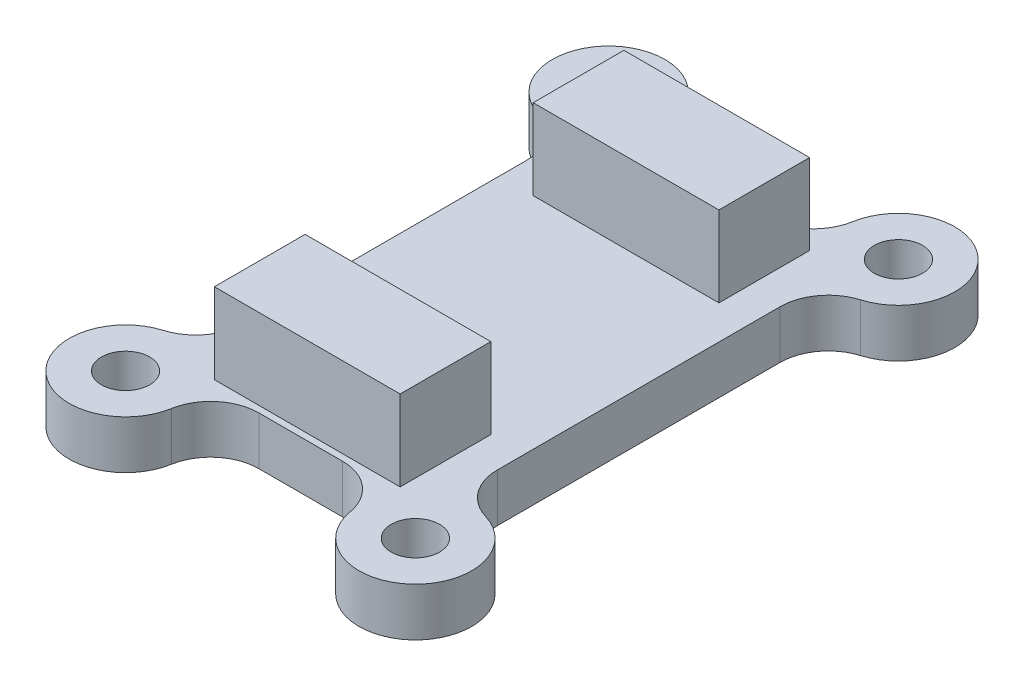
ISO-10303-21;
HEADER;
FILE_DESCRIPTION(('STEP AP214'),'2;1');
FILE_NAME('part.step','',(''),(''),'','','');
FILE_SCHEMA(('AUTOMOTIVE_DESIGN { 1 0 10303 214 1 1 1 1 }'));
ENDSEC;
DATA;
#1=APPLICATION_CONTEXT('core data for automotive mechanical design processes');
#2=APPLICATION_PROTOCOL_DEFINITION('international standard','automotive_design',2000,#1);
#3=PRODUCT_CONTEXT('',#1,'mechanical');
#4=PRODUCT('Part','Part','',(#3));
#5=PRODUCT_RELATED_PRODUCT_CATEGORY('part','',(#4));
#6=PRODUCT_DEFINITION_FORMATION('','',#4);
#7=PRODUCT_DEFINITION_CONTEXT('part definition',#1,'design');
#8=PRODUCT_DEFINITION('design','',#6,#7);
#9=PRODUCT_DEFINITION_SHAPE('','',#8);
#10=(LENGTH_UNIT() NAMED_UNIT(*) SI_UNIT(.MILLI.,.METRE.));
#11=(NAMED_UNIT(*) PLANE_ANGLE_UNIT() SI_UNIT($,.RADIAN.));
#12=(NAMED_UNIT(*) SI_UNIT($,.STERADIAN.) SOLID_ANGLE_UNIT());
#13=UNCERTAINTY_MEASURE_WITH_UNIT(LENGTH_MEASURE(1.E-05),#10,'distance_accuracy_value','');
#14=(GEOMETRIC_REPRESENTATION_CONTEXT(3) GLOBAL_UNCERTAINTY_ASSIGNED_CONTEXT((#13)) GLOBAL_UNIT_ASSIGNED_CONTEXT((#10,
#11,#12)) REPRESENTATION_CONTEXT('',''));
#15=CARTESIAN_POINT('',(0.,0.,0.));
#16=DIRECTION('',(0.,0.,1.));
#17=DIRECTION('',(1.,0.,0.));
#18=AXIS2_PLACEMENT_3D('',#15,#16,#17);
#19=CARTESIAN_POINT('',(0.,3.,0.));
#20=DIRECTION('',(0.,1.,0.));
#21=DIRECTION('',(0.,0.,1.));
#22=AXIS2_PLACEMENT_3D('',#19,#20,#21);
#23=PLANE('',#22);
#24=DIRECTION('',(1.,0.,0.));
#25=VECTOR('',#24,1.);
#26=CARTESIAN_POINT('',(0.,3.,-13.1199094419602));
#27=LINE('',#26,#25);
#28=CARTESIAN_POINT('',(-2.59720351394734,3.,-13.1199094419602));
#29=VERTEX_POINT('',#28);
#30=CARTESIAN_POINT('',(2.59720351394733,3.,-13.1199094419602));
#31=VERTEX_POINT('',#30);
#32=EDGE_CURVE('E315',#29,#31,#27,.T.);
#33=ORIENTED_EDGE('',*,*,#32,.F.);
#34=CARTESIAN_POINT('',(-2.59720351394734,3.,-16.1199094419602));
#35=DIRECTION('',(0.,1.,0.));
#36=DIRECTION('',(0.,0.,1.));
#37=AXIS2_PLACEMENT_3D('',#34,#35,#36);
#38=CIRCLE('',#37,3.);
#39=CARTESIAN_POINT('',(-5.55234035366395,3.,-15.6030281610555));
#40=VERTEX_POINT('',#39);
#41=EDGE_CURVE('E458',#29,#40,#38,.F.);
#42=ORIENTED_EDGE('',*,*,#41,.T.);
#43=CARTESIAN_POINT('',(-9.00000000000001,3.,-15.));
#44=DIRECTION('',(0.,1.,0.));
#45=DIRECTION('',(0.,0.,1.));
#46=AXIS2_PLACEMENT_3D('',#43,#44,#45);
#47=CIRCLE('',#46,3.5);
#48=CARTESIAN_POINT('',(-10.0079707427871,3.,-11.6482847701982));
#49=VERTEX_POINT('',#48);
#50=EDGE_CURVE('E286',#40,#49,#47,.T.);
#51=ORIENTED_EDGE('',*,*,#50,.T.);
#52=CARTESIAN_POINT('',(-10.8719456651761,3.,-8.77538600179671));
#53=DIRECTION('',(0.,1.,0.));
#54=DIRECTION('',(0.,0.,1.));
#55=AXIS2_PLACEMENT_3D('',#52,#53,#54);
#56=CIRCLE('',#55,3.);
#57=CARTESIAN_POINT('',(-7.87194566517612,3.,-8.77538600179671));
#58=VERTEX_POINT('',#57);
#59=EDGE_CURVE('E440',#49,#58,#56,.F.);
#60=ORIENTED_EDGE('',*,*,#59,.T.);
#61=DIRECTION('',(0.,0.,1.));
#62=VECTOR('',#61,1.);
#63=CARTESIAN_POINT('',(-7.87194566517612,3.,0.));
#64=LINE('',#63,#62);
#65=CARTESIAN_POINT('',(-7.87194566517612,3.,8.7753860017967));
#66=VERTEX_POINT('',#65);
#67=EDGE_CURVE('E290',#58,#66,#64,.T.);
#68=ORIENTED_EDGE('',*,*,#67,.T.);
#69=CARTESIAN_POINT('',(-10.8719456651761,3.,8.7753860017967));
#70=DIRECTION('',(0.,1.,0.));
#71=DIRECTION('',(0.,0.,1.));
#72=AXIS2_PLACEMENT_3D('',#69,#70,#71);
#73=CIRCLE('',#72,3.);
#74=CARTESIAN_POINT('',(-10.0079707427871,3.,11.6482847701982));
#75=VERTEX_POINT('',#74);
#76=EDGE_CURVE('E464',#66,#75,#73,.F.);
#77=ORIENTED_EDGE('',*,*,#76,.T.);
#78=CARTESIAN_POINT('',(-9.,3.,15.));
#79=DIRECTION('',(0.,1.,0.));
#80=DIRECTION('',(0.,0.,1.));
#81=AXIS2_PLACEMENT_3D('',#78,#79,#80);
#82=CIRCLE('',#81,3.5);
#83=CARTESIAN_POINT('',(-5.55234035366395,3.,15.6030281610555));
#84=VERTEX_POINT('',#83);
#85=EDGE_CURVE('E295',#75,#84,#82,.T.);
#86=ORIENTED_EDGE('',*,*,#85,.T.);
#87=CARTESIAN_POINT('',(-2.59720351394733,3.,16.1199094419602));
#88=DIRECTION('',(0.,1.,0.));
#89=DIRECTION('',(0.,0.,1.));
#90=AXIS2_PLACEMENT_3D('',#87,#88,#89);
#91=CIRCLE('',#90,3.);
#92=CARTESIAN_POINT('',(-2.59720351394733,3.,13.1199094419602));
#93=VERTEX_POINT('',#92);
#94=EDGE_CURVE('E470',#84,#93,#91,.F.);
#95=ORIENTED_EDGE('',*,*,#94,.T.);
#96=DIRECTION('',(1.,0.,0.));
#97=VECTOR('',#96,1.);
#98=CARTESIAN_POINT('',(0.,3.,13.1199094419602));
#99=LINE('',#98,#97);
#100=CARTESIAN_POINT('',(2.59720351394733,3.,13.1199094419602));
#101=VERTEX_POINT('',#100);
#102=EDGE_CURVE('E299',#93,#101,#99,.T.);
#103=ORIENTED_EDGE('',*,*,#102,.T.);
#104=CARTESIAN_POINT('',(2.59720351394733,3.,16.1199094419602));
#105=DIRECTION('',(0.,1.,0.));
#106=DIRECTION('',(0.,0.,1.));
#107=AXIS2_PLACEMENT_3D('',#104,#105,#106);
#108=CIRCLE('',#107,3.);
#109=CARTESIAN_POINT('',(5.55234035366395,3.,15.6030281610555));
#110=VERTEX_POINT('',#109);
#111=EDGE_CURVE('E476',#101,#110,#108,.F.);
#112=ORIENTED_EDGE('',*,*,#111,.T.);
#113=CARTESIAN_POINT('',(9.,3.,15.));
#114=DIRECTION('',(0.,1.,0.));
#115=DIRECTION('',(0.,0.,1.));
#116=AXIS2_PLACEMENT_3D('',#113,#114,#115);
#117=CIRCLE('',#116,3.5);
#118=CARTESIAN_POINT('',(10.0079707427871,3.,11.6482847701982));
#119=VERTEX_POINT('',#118);
#120=EDGE_CURVE('E303',#110,#119,#117,.T.);
#121=ORIENTED_EDGE('',*,*,#120,.T.);
#122=CARTESIAN_POINT('',(10.8719456651761,3.,8.7753860017967));
#123=DIRECTION('',(0.,1.,0.));
#124=DIRECTION('',(0.,0.,1.));
#125=AXIS2_PLACEMENT_3D('',#122,#123,#124);
#126=CIRCLE('',#125,3.);
#127=CARTESIAN_POINT('',(7.87194566517612,3.,8.7753860017967));
#128=VERTEX_POINT('',#127);
#129=EDGE_CURVE('E11',#119,#128,#126,.F.);
#130=ORIENTED_EDGE('',*,*,#129,.T.);
#131=DIRECTION('',(0.,0.,1.));
#132=VECTOR('',#131,1.);
#133=CARTESIAN_POINT('',(7.87194566517612,3.,0.));
#134=LINE('',#133,#132);
#135=CARTESIAN_POINT('',(7.87194566517612,3.,-8.77538600179672));
#136=VERTEX_POINT('',#135);
#137=EDGE_CURVE('E307',#136,#128,#134,.T.);
#138=ORIENTED_EDGE('',*,*,#137,.F.);
#139=CARTESIAN_POINT('',(10.8719456651761,3.,-8.77538600179672));
#140=DIRECTION('',(0.,1.,0.));
#141=DIRECTION('',(0.,0.,1.));
#142=AXIS2_PLACEMENT_3D('',#139,#140,#141);
#143=CIRCLE('',#142,3.);
#144=CARTESIAN_POINT('',(10.0079707427871,3.,-11.6482847701982));
#145=VERTEX_POINT('',#144);
#146=EDGE_CURVE('E446',#136,#145,#143,.F.);
#147=ORIENTED_EDGE('',*,*,#146,.T.);
#148=CARTESIAN_POINT('',(8.99999999999999,3.,-15.));
#149=DIRECTION('',(0.,1.,0.));
#150=DIRECTION('',(0.,0.,1.));
#151=AXIS2_PLACEMENT_3D('',#148,#149,#150);
#152=CIRCLE('',#151,3.5);
#153=CARTESIAN_POINT('',(5.55234035366394,3.,-15.6030281610555));
#154=VERTEX_POINT('',#153);
#155=EDGE_CURVE('E311',#145,#154,#152,.T.);
#156=ORIENTED_EDGE('',*,*,#155,.T.);
#157=CARTESIAN_POINT('',(2.59720351394733,3.,-16.1199094419602));
#158=DIRECTION('',(0.,1.,0.));
#159=DIRECTION('',(0.,0.,1.));
#160=AXIS2_PLACEMENT_3D('',#157,#158,#159);
#161=CIRCLE('',#160,3.);
#162=EDGE_CURVE('E452',#154,#31,#161,.F.);
#163=ORIENTED_EDGE('',*,*,#162,.T.);
#164=EDGE_LOOP('',(#33,#42,#51,#60,#68,#77,#86,#95,#103,#112,#121,#130,#138,#147,#156,#163));
#165=FACE_BOUND('',#164,.T.);
#166=CARTESIAN_POINT('',(8.99999999999999,3.,-15.));
#167=DIRECTION('',(0.,1.,0.));
#168=DIRECTION('',(0.,0.,1.));
#169=AXIS2_PLACEMENT_3D('',#166,#167,#168);
#170=CIRCLE('',#169,1.5);
#171=CARTESIAN_POINT('',(8.99999999999999,3.,-13.5));
#172=VERTEX_POINT('',#171);
#173=EDGE_CURVE('E319',#172,#172,#170,.T.);
#174=ORIENTED_EDGE('',*,*,#173,.F.);
#175=EDGE_LOOP('',(#174));
#176=FACE_BOUND('',#175,.T.);
#177=CARTESIAN_POINT('',(9.,3.,15.));
#178=DIRECTION('',(0.,1.,0.));
#179=DIRECTION('',(0.,0.,1.));
#180=AXIS2_PLACEMENT_3D('',#177,#178,#179);
#181=CIRCLE('',#180,1.5);
#182=CARTESIAN_POINT('',(9.,3.,16.5));
#183=VERTEX_POINT('',#182);
#184=EDGE_CURVE('E323',#183,#183,#181,.T.);
#185=ORIENTED_EDGE('',*,*,#184,.F.);
#186=EDGE_LOOP('',(#185));
#187=FACE_BOUND('',#186,.T.);
#188=CARTESIAN_POINT('',(-9.,3.,15.));
#189=DIRECTION('',(0.,1.,0.));
#190=DIRECTION('',(0.,0.,1.));
#191=AXIS2_PLACEMENT_3D('',#188,#189,#190);
#192=CIRCLE('',#191,1.5);
#193=CARTESIAN_POINT('',(-9.,3.,16.5));
#194=VERTEX_POINT('',#193);
#195=EDGE_CURVE('E327',#194,#194,#192,.T.);
#196=ORIENTED_EDGE('',*,*,#195,.F.);
#197=EDGE_LOOP('',(#196));
#198=FACE_BOUND('',#197,.T.);
#199=CARTESIAN_POINT('',(-9.00000000000001,3.,-15.));
#200=DIRECTION('',(0.,1.,0.));
#201=DIRECTION('',(0.,0.,1.));
#202=AXIS2_PLACEMENT_3D('',#199,#200,#201);
#203=CIRCLE('',#202,1.5);
#204=CARTESIAN_POINT('',(-9.00000000000001,3.,-13.5));
#205=VERTEX_POINT('',#204);
#206=EDGE_CURVE('E331',#205,#205,#203,.T.);
#207=ORIENTED_EDGE('',*,*,#206,.F.);
#208=EDGE_LOOP('',(#207));
#209=FACE_BOUND('',#208,.T.);
#210=DIRECTION('',(1.,0.,0.));
#211=VECTOR('',#210,1.);
#212=CARTESIAN_POINT('',(-5.76744651204602,3.,-7.08188781014022));
#213=LINE('',#212,#211);
#214=CARTESIAN_POINT('',(-5.76744651204602,3.,-7.08188781014022));
#215=VERTEX_POINT('',#214);
#216=CARTESIAN_POINT('',(5.76744651204602,3.,-7.08188781014022));
#217=VERTEX_POINT('',#216);
#218=EDGE_CURVE('E236',#215,#217,#213,.T.);
#219=ORIENTED_EDGE('',*,*,#218,.F.);
#220=DIRECTION('',(0.,0.,1.));
#221=VECTOR('',#220,1.);
#222=CARTESIAN_POINT('',(-5.76744651204602,3.,-12.7152076591154));
#223=LINE('',#222,#221);
#224=CARTESIAN_POINT('',(-5.76744651204602,3.,-12.7152076591154));
#225=VERTEX_POINT('',#224);
#226=EDGE_CURVE('E231',#225,#215,#223,.T.);
#227=ORIENTED_EDGE('',*,*,#226,.F.);
#228=DIRECTION('',(-1.,0.,0.));
#229=VECTOR('',#228,1.);
#230=CARTESIAN_POINT('',(-5.76744651204602,3.,-12.7152076591154));
#231=LINE('',#230,#229);
#232=CARTESIAN_POINT('',(5.76744651204602,3.,-12.7152076591154));
#233=VERTEX_POINT('',#232);
#234=EDGE_CURVE('E256',#233,#225,#231,.T.);
#235=ORIENTED_EDGE('',*,*,#234,.F.);
#236=DIRECTION('',(0.,0.,-1.));
#237=VECTOR('',#236,1.);
#238=CARTESIAN_POINT('',(5.76744651204602,3.,-12.7152076591154));
#239=LINE('',#238,#237);
#240=EDGE_CURVE('E268',#217,#233,#239,.T.);
#241=ORIENTED_EDGE('',*,*,#240,.F.);
#242=EDGE_LOOP('',(#219,#227,#235,#241));
#243=FACE_BOUND('',#242,.T.);
#244=DIRECTION('',(1.,0.,0.));
#245=VECTOR('',#244,1.);
#246=CARTESIAN_POINT('',(-5.76744651204602,3.,12.7152076591154));
#247=LINE('',#246,#245);
#248=CARTESIAN_POINT('',(-5.76744651204602,3.,12.7152076591154));
#249=VERTEX_POINT('',#248);
#250=CARTESIAN_POINT('',(5.76744651204602,3.,12.7152076591154));
#251=VERTEX_POINT('',#250);
#252=EDGE_CURVE('E229',#249,#251,#247,.T.);
#253=ORIENTED_EDGE('',*,*,#252,.F.);
#254=DIRECTION('',(0.,0.,1.));
#255=VECTOR('',#254,1.);
#256=CARTESIAN_POINT('',(-5.76744651204602,3.,7.08188781014022));
#257=LINE('',#256,#255);
#258=CARTESIAN_POINT('',(-5.76744651204602,3.,7.08188781014022));
#259=VERTEX_POINT('',#258);
#260=EDGE_CURVE('E223',#259,#249,#257,.T.);
#261=ORIENTED_EDGE('',*,*,#260,.F.);
#262=DIRECTION('',(-1.,0.,0.));
#263=VECTOR('',#262,1.);
#264=CARTESIAN_POINT('',(-5.76744651204602,3.,7.08188781014022));
#265=LINE('',#264,#263);
#266=CARTESIAN_POINT('',(5.76744651204602,3.,7.08188781014022));
#267=VERTEX_POINT('',#266);
#268=EDGE_CURVE('E207',#267,#259,#265,.T.);
#269=ORIENTED_EDGE('',*,*,#268,.F.);
#270=DIRECTION('',(0.,0.,-1.));
#271=VECTOR('',#270,1.);
#272=CARTESIAN_POINT('',(5.76744651204602,3.,7.08188781014022));
#273=LINE('',#272,#271);
#274=EDGE_CURVE('E216',#251,#267,#273,.T.);
#275=ORIENTED_EDGE('',*,*,#274,.F.);
#276=EDGE_LOOP('',(#253,#261,#269,#275));
#277=FACE_BOUND('',#276,.T.);
#278=ADVANCED_FACE('F45',(#165,#176,#187,#198,#209,#243,#277),#23,.T.);
#279=CARTESIAN_POINT('',(-9.00000000000001,3.,-15.));
#280=DIRECTION('',(0.,-1.,0.));
#281=DIRECTION('',(0.,0.,-1.));
#282=AXIS2_PLACEMENT_3D('',#279,#280,#281);
#283=CYLINDRICAL_SURFACE('',#282,3.5);
#284=CARTESIAN_POINT('',(-9.00000000000001,0.,-15.));
#285=DIRECTION('',(0.,1.,0.));
#286=DIRECTION('',(0.,0.,1.));
#287=AXIS2_PLACEMENT_3D('',#284,#285,#286);
#288=CIRCLE('',#287,3.5);
#289=CARTESIAN_POINT('',(-5.55234035366395,0.,-15.6030281610555));
#290=VERTEX_POINT('',#289);
#291=CARTESIAN_POINT('',(-10.0079707427871,0.,-11.6482847701982));
#292=VERTEX_POINT('',#291);
#293=EDGE_CURVE('E285',#290,#292,#288,.T.);
#294=ORIENTED_EDGE('',*,*,#293,.T.);
#295=DIRECTION('',(0.,-1.,0.));
#296=VECTOR('',#295,1.);
#297=CARTESIAN_POINT('',(-10.0079707427871,3.,-11.6482847701982));
#298=LINE('',#297,#296);
#299=EDGE_CURVE('E392',#292,#49,#298,.F.);
#300=ORIENTED_EDGE('',*,*,#299,.T.);
#301=ORIENTED_EDGE('',*,*,#50,.F.);
#302=DIRECTION('',(0.,-1.,0.));
#303=VECTOR('',#302,1.);
#304=CARTESIAN_POINT('',(-5.55234035366395,3.,-15.6030281610555));
#305=LINE('',#304,#303);
#306=EDGE_CURVE('E388',#40,#290,#305,.T.);
#307=ORIENTED_EDGE('',*,*,#306,.T.);
#308=EDGE_LOOP('',(#294,#300,#301,#307));
#309=FACE_BOUND('',#308,.T.);
#310=ADVANCED_FACE('F524',(#309),#283,.T.);
#311=CARTESIAN_POINT('',(-7.87194566517612,3.,0.));
#312=DIRECTION('',(1.,0.,0.));
#313=DIRECTION('',(0.,0.,-1.));
#314=AXIS2_PLACEMENT_3D('',#311,#312,#313);
#315=PLANE('',#314);
#316=ORIENTED_EDGE('',*,*,#67,.F.);
#317=DIRECTION('',(0.,1.,0.));
#318=VECTOR('',#317,1.);
#319=CARTESIAN_POINT('',(-7.87194566517612,0.,-8.77538600179671));
#320=LINE('',#319,#318);
#321=CARTESIAN_POINT('',(-7.87194566517612,0.,-8.77538600179671));
#322=VERTEX_POINT('',#321);
#323=EDGE_CURVE('E384',#58,#322,#320,.F.);
#324=ORIENTED_EDGE('',*,*,#323,.T.);
#325=DIRECTION('',(0.,0.,1.));
#326=VECTOR('',#325,1.);
#327=CARTESIAN_POINT('',(-7.87194566517612,0.,0.));
#328=LINE('',#327,#326);
#329=CARTESIAN_POINT('',(-7.87194566517612,0.,8.7753860017967));
#330=VERTEX_POINT('',#329);
#331=EDGE_CURVE('E339',#322,#330,#328,.T.);
#332=ORIENTED_EDGE('',*,*,#331,.T.);
#333=DIRECTION('',(0.,1.,0.));
#334=VECTOR('',#333,1.);
#335=CARTESIAN_POINT('',(-7.87194566517612,3.,8.7753860017967));
#336=LINE('',#335,#334);
#337=EDGE_CURVE('E335',#330,#66,#336,.T.);
#338=ORIENTED_EDGE('',*,*,#337,.T.);
#339=EDGE_LOOP('',(#316,#324,#332,#338));
#340=FACE_BOUND('',#339,.T.);
#341=ADVANCED_FACE('F532',(#340),#315,.F.);
#342=CARTESIAN_POINT('',(-9.,3.,15.));
#343=DIRECTION('',(0.,-1.,0.));
#344=DIRECTION('',(0.,0.,-1.));
#345=AXIS2_PLACEMENT_3D('',#342,#343,#344);
#346=CYLINDRICAL_SURFACE('',#345,3.5);
#347=ORIENTED_EDGE('',*,*,#85,.F.);
#348=DIRECTION('',(0.,-1.,0.));
#349=VECTOR('',#348,1.);
#350=CARTESIAN_POINT('',(-10.0079707427871,3.,11.6482847701982));
#351=LINE('',#350,#349);
#352=CARTESIAN_POINT('',(-10.0079707427871,0.,11.6482847701982));
#353=VERTEX_POINT('',#352);
#354=EDGE_CURVE('E419',#75,#353,#351,.T.);
#355=ORIENTED_EDGE('',*,*,#354,.T.);
#356=CARTESIAN_POINT('',(-9.,0.,15.));
#357=DIRECTION('',(0.,1.,0.));
#358=DIRECTION('',(0.,0.,1.));
#359=AXIS2_PLACEMENT_3D('',#356,#357,#358);
#360=CIRCLE('',#359,3.5);
#361=CARTESIAN_POINT('',(-5.55234035366395,0.,15.6030281610555));
#362=VERTEX_POINT('',#361);
#363=EDGE_CURVE('E343',#353,#362,#360,.T.);
#364=ORIENTED_EDGE('',*,*,#363,.T.);
#365=DIRECTION('',(0.,-1.,0.));
#366=VECTOR('',#365,1.);
#367=CARTESIAN_POINT('',(-5.55234035366395,3.,15.6030281610555));
#368=LINE('',#367,#366);
#369=EDGE_CURVE('E416',#362,#84,#368,.F.);
#370=ORIENTED_EDGE('',*,*,#369,.T.);
#371=EDGE_LOOP('',(#347,#355,#364,#370));
#372=FACE_BOUND('',#371,.T.);
#373=ADVANCED_FACE('F541',(#372),#346,.T.);
#374=CARTESIAN_POINT('',(0.,3.,13.1199094419602));
#375=DIRECTION('',(0.,0.,-1.));
#376=DIRECTION('',(-1.,0.,0.));
#377=AXIS2_PLACEMENT_3D('',#374,#375,#376);
#378=PLANE('',#377);
#379=ORIENTED_EDGE('',*,*,#102,.F.);
#380=DIRECTION('',(0.,1.,0.));
#381=VECTOR('',#380,1.);
#382=CARTESIAN_POINT('',(-2.59720351394733,0.,13.1199094419602));
#383=LINE('',#382,#381);
#384=CARTESIAN_POINT('',(-2.59720351394733,0.,13.1199094419602));
#385=VERTEX_POINT('',#384);
#386=EDGE_CURVE('E426',#93,#385,#383,.F.);
#387=ORIENTED_EDGE('',*,*,#386,.T.);
#388=DIRECTION('',(1.,0.,0.));
#389=VECTOR('',#388,1.);
#390=CARTESIAN_POINT('',(0.,0.,13.1199094419602));
#391=LINE('',#390,#389);
#392=CARTESIAN_POINT('',(2.59720351394733,0.,13.1199094419602));
#393=VERTEX_POINT('',#392);
#394=EDGE_CURVE('E347',#385,#393,#391,.T.);
#395=ORIENTED_EDGE('',*,*,#394,.T.);
#396=DIRECTION('',(0.,1.,0.));
#397=VECTOR('',#396,1.);
#398=CARTESIAN_POINT('',(2.59720351394733,3.,13.1199094419602));
#399=LINE('',#398,#397);
#400=EDGE_CURVE('E423',#393,#101,#399,.T.);
#401=ORIENTED_EDGE('',*,*,#400,.T.);
#402=EDGE_LOOP('',(#379,#387,#395,#401));
#403=FACE_BOUND('',#402,.T.);
#404=ADVANCED_FACE('F550',(#403),#378,.F.);
#405=CARTESIAN_POINT('',(9.,3.,15.));
#406=DIRECTION('',(0.,-1.,0.));
#407=DIRECTION('',(0.,0.,-1.));
#408=AXIS2_PLACEMENT_3D('',#405,#406,#407);
#409=CYLINDRICAL_SURFACE('',#408,3.5);
#410=ORIENTED_EDGE('',*,*,#120,.F.);
#411=DIRECTION('',(0.,-1.,0.));
#412=VECTOR('',#411,1.);
#413=CARTESIAN_POINT('',(5.55234035366395,3.,15.6030281610555));
#414=LINE('',#413,#412);
#415=CARTESIAN_POINT('',(5.55234035366395,0.,15.6030281610555));
#416=VERTEX_POINT('',#415);
#417=EDGE_CURVE('E433',#110,#416,#414,.T.);
#418=ORIENTED_EDGE('',*,*,#417,.T.);
#419=CARTESIAN_POINT('',(9.,0.,15.));
#420=DIRECTION('',(0.,1.,0.));
#421=DIRECTION('',(0.,0.,1.));
#422=AXIS2_PLACEMENT_3D('',#419,#420,#421);
#423=CIRCLE('',#422,3.5);
#424=CARTESIAN_POINT('',(10.0079707427871,0.,11.6482847701982));
#425=VERTEX_POINT('',#424);
#426=EDGE_CURVE('E351',#416,#425,#423,.T.);
#427=ORIENTED_EDGE('',*,*,#426,.T.);
#428=DIRECTION('',(0.,-1.,0.));
#429=VECTOR('',#428,1.);
#430=CARTESIAN_POINT('',(10.0079707427871,3.,11.6482847701982));
#431=LINE('',#430,#429);
#432=EDGE_CURVE('E430',#425,#119,#431,.F.);
#433=ORIENTED_EDGE('',*,*,#432,.T.);
#434=EDGE_LOOP('',(#410,#418,#427,#433));
#435=FACE_BOUND('',#434,.T.);
#436=ADVANCED_FACE('F490',(#435),#409,.T.);
#437=CARTESIAN_POINT('',(7.87194566517612,3.,0.));
#438=DIRECTION('',(1.,0.,0.));
#439=DIRECTION('',(0.,0.,-1.));
#440=AXIS2_PLACEMENT_3D('',#437,#438,#439);
#441=PLANE('',#440);
#442=DIRECTION('',(0.,0.,1.));
#443=VECTOR('',#442,1.);
#444=CARTESIAN_POINT('',(7.87194566517612,0.,0.));
#445=LINE('',#444,#443);
#446=CARTESIAN_POINT('',(7.87194566517612,0.,-8.77538600179672));
#447=VERTEX_POINT('',#446);
#448=CARTESIAN_POINT('',(7.87194566517612,0.,8.7753860017967));
#449=VERTEX_POINT('',#448);
#450=EDGE_CURVE('E355',#447,#449,#445,.T.);
#451=ORIENTED_EDGE('',*,*,#450,.F.);
#452=DIRECTION('',(0.,-1.,0.));
#453=VECTOR('',#452,1.);
#454=CARTESIAN_POINT('',(7.87194566517612,3.,-8.77538600179672));
#455=LINE('',#454,#453);
#456=EDGE_CURVE('E406',#447,#136,#455,.F.);
#457=ORIENTED_EDGE('',*,*,#456,.T.);
#458=ORIENTED_EDGE('',*,*,#137,.T.);
#459=DIRECTION('',(0.,-1.,0.));
#460=VECTOR('',#459,1.);
#461=CARTESIAN_POINT('',(7.87194566517612,3.,8.7753860017967));
#462=LINE('',#461,#460);
#463=EDGE_CURVE('E402',#128,#449,#462,.T.);
#464=ORIENTED_EDGE('',*,*,#463,.T.);
#465=EDGE_LOOP('',(#451,#457,#458,#464));
#466=FACE_BOUND('',#465,.T.);
#467=ADVANCED_FACE('F499',(#466),#441,.T.);
#468=CARTESIAN_POINT('',(8.99999999999999,3.,-15.));
#469=DIRECTION('',(0.,-1.,0.));
#470=DIRECTION('',(0.,0.,-1.));
#471=AXIS2_PLACEMENT_3D('',#468,#469,#470);
#472=CYLINDRICAL_SURFACE('',#471,3.5);
#473=ORIENTED_EDGE('',*,*,#155,.F.);
#474=DIRECTION('',(0.,-1.,0.));
#475=VECTOR('',#474,1.);
#476=CARTESIAN_POINT('',(10.0079707427871,3.,-11.6482847701982));
#477=LINE('',#476,#475);
#478=CARTESIAN_POINT('',(10.0079707427871,0.,-11.6482847701982));
#479=VERTEX_POINT('',#478);
#480=EDGE_CURVE('E398',#145,#479,#477,.T.);
#481=ORIENTED_EDGE('',*,*,#480,.T.);
#482=CARTESIAN_POINT('',(8.99999999999999,0.,-15.));
#483=DIRECTION('',(0.,1.,0.));
#484=DIRECTION('',(0.,0.,1.));
#485=AXIS2_PLACEMENT_3D('',#482,#483,#484);
#486=CIRCLE('',#485,3.5);
#487=CARTESIAN_POINT('',(5.55234035366394,0.,-15.6030281610555));
#488=VERTEX_POINT('',#487);
#489=EDGE_CURVE('E359',#479,#488,#486,.T.);
#490=ORIENTED_EDGE('',*,*,#489,.T.);
#491=DIRECTION('',(0.,-1.,0.));
#492=VECTOR('',#491,1.);
#493=CARTESIAN_POINT('',(5.55234035366394,3.,-15.6030281610555));
#494=LINE('',#493,#492);
#495=EDGE_CURVE('E395',#488,#154,#494,.F.);
#496=ORIENTED_EDGE('',*,*,#495,.T.);
#497=EDGE_LOOP('',(#473,#481,#490,#496));
#498=FACE_BOUND('',#497,.T.);
#499=ADVANCED_FACE('F507',(#498),#472,.T.);
#500=CARTESIAN_POINT('',(-9.,3.,15.));
#501=DIRECTION('',(0.,-1.,0.));
#502=DIRECTION('',(0.,0.,-1.));
#503=AXIS2_PLACEMENT_3D('',#500,#501,#502);
#504=CYLINDRICAL_SURFACE('',#503,1.5);
#505=ORIENTED_EDGE('',*,*,#195,.T.);
#506=EDGE_LOOP('',(#505));
#507=FACE_BOUND('',#506,.T.);
#508=CARTESIAN_POINT('',(-9.,0.,15.));
#509=DIRECTION('',(0.,1.,0.));
#510=DIRECTION('',(0.,0.,1.));
#511=AXIS2_PLACEMENT_3D('',#508,#509,#510);
#512=CIRCLE('',#511,1.5);
#513=CARTESIAN_POINT('',(-9.,0.,16.5));
#514=VERTEX_POINT('',#513);
#515=EDGE_CURVE('E375',#514,#514,#512,.T.);
#516=ORIENTED_EDGE('',*,*,#515,.F.);
#517=EDGE_LOOP('',(#516));
#518=FACE_BOUND('',#517,.T.);
#519=ADVANCED_FACE('F577',(#507,#518),#504,.F.);
#520=CARTESIAN_POINT('',(9.,3.,15.));
#521=DIRECTION('',(0.,-1.,0.));
#522=DIRECTION('',(0.,0.,-1.));
#523=AXIS2_PLACEMENT_3D('',#520,#521,#522);
#524=CYLINDRICAL_SURFACE('',#523,1.5);
#525=ORIENTED_EDGE('',*,*,#184,.T.);
#526=EDGE_LOOP('',(#525));
#527=FACE_BOUND('',#526,.T.);
#528=CARTESIAN_POINT('',(9.,0.,15.));
#529=DIRECTION('',(0.,1.,0.));
#530=DIRECTION('',(0.,0.,1.));
#531=AXIS2_PLACEMENT_3D('',#528,#529,#530);
#532=CIRCLE('',#531,1.5);
#533=CARTESIAN_POINT('',(9.,0.,16.5));
#534=VERTEX_POINT('',#533);
#535=EDGE_CURVE('E371',#534,#534,#532,.T.);
#536=ORIENTED_EDGE('',*,*,#535,.F.);
#537=EDGE_LOOP('',(#536));
#538=FACE_BOUND('',#537,.T.);
#539=ADVANCED_FACE('F580',(#527,#538),#524,.F.);
#540=CARTESIAN_POINT('',(8.99999999999999,3.,-15.));
#541=DIRECTION('',(0.,-1.,0.));
#542=DIRECTION('',(0.,0.,-1.));
#543=AXIS2_PLACEMENT_3D('',#540,#541,#542);
#544=CYLINDRICAL_SURFACE('',#543,1.5);
#545=ORIENTED_EDGE('',*,*,#173,.T.);
#546=EDGE_LOOP('',(#545));
#547=FACE_BOUND('',#546,.T.);
#548=CARTESIAN_POINT('',(8.99999999999999,0.,-15.));
#549=DIRECTION('',(0.,1.,0.));
#550=DIRECTION('',(0.,0.,1.));
#551=AXIS2_PLACEMENT_3D('',#548,#549,#550);
#552=CIRCLE('',#551,1.5);
#553=CARTESIAN_POINT('',(8.99999999999999,0.,-13.5));
#554=VERTEX_POINT('',#553);
#555=EDGE_CURVE('E367',#554,#554,#552,.T.);
#556=ORIENTED_EDGE('',*,*,#555,.F.);
#557=EDGE_LOOP('',(#556));
#558=FACE_BOUND('',#557,.T.);
#559=ADVANCED_FACE('F584',(#547,#558),#544,.F.);
#560=CARTESIAN_POINT('',(0.,3.,-13.1199094419602));
#561=DIRECTION('',(0.,0.,-1.));
#562=DIRECTION('',(-1.,0.,0.));
#563=AXIS2_PLACEMENT_3D('',#560,#561,#562);
#564=PLANE('',#563);
#565=ORIENTED_EDGE('',*,*,#32,.T.);
#566=DIRECTION('',(0.,-1.,0.));
#567=VECTOR('',#566,1.);
#568=CARTESIAN_POINT('',(2.59720351394733,3.,-13.1199094419602));
#569=LINE('',#568,#567);
#570=CARTESIAN_POINT('',(2.59720351394733,0.,-13.1199094419602));
#571=VERTEX_POINT('',#570);
#572=EDGE_CURVE('E412',#31,#571,#569,.T.);
#573=ORIENTED_EDGE('',*,*,#572,.T.);
#574=DIRECTION('',(1.,0.,0.));
#575=VECTOR('',#574,1.);
#576=CARTESIAN_POINT('',(0.,0.,-13.1199094419602));
#577=LINE('',#576,#575);
#578=CARTESIAN_POINT('',(-2.59720351394734,0.,-13.1199094419602));
#579=VERTEX_POINT('',#578);
#580=EDGE_CURVE('E363',#579,#571,#577,.T.);
#581=ORIENTED_EDGE('',*,*,#580,.F.);
#582=DIRECTION('',(0.,-1.,0.));
#583=VECTOR('',#582,1.);
#584=CARTESIAN_POINT('',(-2.59720351394734,3.,-13.1199094419602));
#585=LINE('',#584,#583);
#586=EDGE_CURVE('E409',#579,#29,#585,.F.);
#587=ORIENTED_EDGE('',*,*,#586,.T.);
#588=EDGE_LOOP('',(#565,#573,#581,#587));
#589=FACE_BOUND('',#588,.T.);
#590=ADVANCED_FACE('F515',(#589),#564,.T.);
#591=CARTESIAN_POINT('',(-9.00000000000001,3.,-15.));
#592=DIRECTION('',(0.,-1.,0.));
#593=DIRECTION('',(0.,0.,-1.));
#594=AXIS2_PLACEMENT_3D('',#591,#592,#593);
#595=CYLINDRICAL_SURFACE('',#594,1.5);
#596=ORIENTED_EDGE('',*,*,#206,.T.);
#597=EDGE_LOOP('',(#596));
#598=FACE_BOUND('',#597,.T.);
#599=CARTESIAN_POINT('',(-9.00000000000001,0.,-15.));
#600=DIRECTION('',(0.,1.,0.));
#601=DIRECTION('',(0.,0.,1.));
#602=AXIS2_PLACEMENT_3D('',#599,#600,#601);
#603=CIRCLE('',#602,1.5);
#604=CARTESIAN_POINT('',(-9.00000000000001,0.,-13.5));
#605=VERTEX_POINT('',#604);
#606=EDGE_CURVE('E291',#605,#605,#603,.T.);
#607=ORIENTED_EDGE('',*,*,#606,.F.);
#608=EDGE_LOOP('',(#607));
#609=FACE_BOUND('',#608,.T.);
#610=ADVANCED_FACE('F573',(#598,#609),#595,.F.);
#611=CARTESIAN_POINT('',(0.,0.,0.));
#612=DIRECTION('',(0.,1.,0.));
#613=DIRECTION('',(0.,0.,1.));
#614=AXIS2_PLACEMENT_3D('',#611,#612,#613);
#615=PLANE('',#614);
#616=ORIENTED_EDGE('',*,*,#293,.F.);
#617=CARTESIAN_POINT('',(-2.59720351394734,0.,-16.1199094419602));
#618=DIRECTION('',(0.,1.,0.));
#619=DIRECTION('',(0.,0.,1.));
#620=AXIS2_PLACEMENT_3D('',#617,#618,#619);
#621=CIRCLE('',#620,3.);
#622=EDGE_CURVE('E455',#290,#579,#621,.T.);
#623=ORIENTED_EDGE('',*,*,#622,.T.);
#624=ORIENTED_EDGE('',*,*,#580,.T.);
#625=CARTESIAN_POINT('',(2.59720351394733,0.,-16.1199094419602));
#626=DIRECTION('',(0.,1.,0.));
#627=DIRECTION('',(0.,0.,1.));
#628=AXIS2_PLACEMENT_3D('',#625,#626,#627);
#629=CIRCLE('',#628,3.);
#630=EDGE_CURVE('E449',#571,#488,#629,.T.);
#631=ORIENTED_EDGE('',*,*,#630,.T.);
#632=ORIENTED_EDGE('',*,*,#489,.F.);
#633=CARTESIAN_POINT('',(10.8719456651761,0.,-8.77538600179672));
#634=DIRECTION('',(0.,1.,0.));
#635=DIRECTION('',(0.,0.,1.));
#636=AXIS2_PLACEMENT_3D('',#633,#634,#635);
#637=CIRCLE('',#636,3.);
#638=EDGE_CURVE('E443',#479,#447,#637,.T.);
#639=ORIENTED_EDGE('',*,*,#638,.T.);
#640=ORIENTED_EDGE('',*,*,#450,.T.);
#641=CARTESIAN_POINT('',(10.8719456651761,0.,8.7753860017967));
#642=DIRECTION('',(0.,1.,0.));
#643=DIRECTION('',(0.,0.,1.));
#644=AXIS2_PLACEMENT_3D('',#641,#642,#643);
#645=CIRCLE('',#644,3.);
#646=EDGE_CURVE('E54',#449,#425,#645,.T.);
#647=ORIENTED_EDGE('',*,*,#646,.T.);
#648=ORIENTED_EDGE('',*,*,#426,.F.);
#649=CARTESIAN_POINT('',(2.59720351394733,0.,16.1199094419602));
#650=DIRECTION('',(0.,1.,0.));
#651=DIRECTION('',(0.,0.,1.));
#652=AXIS2_PLACEMENT_3D('',#649,#650,#651);
#653=CIRCLE('',#652,3.);
#654=EDGE_CURVE('E473',#416,#393,#653,.T.);
#655=ORIENTED_EDGE('',*,*,#654,.T.);
#656=ORIENTED_EDGE('',*,*,#394,.F.);
#657=CARTESIAN_POINT('',(-2.59720351394733,0.,16.1199094419602));
#658=DIRECTION('',(0.,1.,0.));
#659=DIRECTION('',(0.,0.,1.));
#660=AXIS2_PLACEMENT_3D('',#657,#658,#659);
#661=CIRCLE('',#660,3.);
#662=EDGE_CURVE('E467',#385,#362,#661,.T.);
#663=ORIENTED_EDGE('',*,*,#662,.T.);
#664=ORIENTED_EDGE('',*,*,#363,.F.);
#665=CARTESIAN_POINT('',(-10.8719456651761,0.,8.7753860017967));
#666=DIRECTION('',(0.,1.,0.));
#667=DIRECTION('',(0.,0.,1.));
#668=AXIS2_PLACEMENT_3D('',#665,#666,#667);
#669=CIRCLE('',#668,3.);
#670=EDGE_CURVE('E461',#353,#330,#669,.T.);
#671=ORIENTED_EDGE('',*,*,#670,.T.);
#672=ORIENTED_EDGE('',*,*,#331,.F.);
#673=CARTESIAN_POINT('',(-10.8719456651761,0.,-8.77538600179671));
#674=DIRECTION('',(0.,1.,0.));
#675=DIRECTION('',(0.,0.,1.));
#676=AXIS2_PLACEMENT_3D('',#673,#674,#675);
#677=CIRCLE('',#676,3.);
#678=EDGE_CURVE('E437',#322,#292,#677,.T.);
#679=ORIENTED_EDGE('',*,*,#678,.T.);
#680=EDGE_LOOP('',(#616,#623,#624,#631,#632,#639,#640,#647,#648,#655,#656,#663,#664,#671,#672,#679));
#681=FACE_BOUND('',#680,.T.);
#682=ORIENTED_EDGE('',*,*,#555,.T.);
#683=EDGE_LOOP('',(#682));
#684=FACE_BOUND('',#683,.T.);
#685=ORIENTED_EDGE('',*,*,#535,.T.);
#686=EDGE_LOOP('',(#685));
#687=FACE_BOUND('',#686,.T.);
#688=ORIENTED_EDGE('',*,*,#515,.T.);
#689=EDGE_LOOP('',(#688));
#690=FACE_BOUND('',#689,.T.);
#691=ORIENTED_EDGE('',*,*,#606,.T.);
#692=EDGE_LOOP('',(#691));
#693=FACE_BOUND('',#692,.T.);
#694=ADVANCED_FACE('F482',(#681,#684,#687,#690,#693),#615,.F.);
#695=CARTESIAN_POINT('',(-10.8719456651761,3.,-8.77538600179671));
#696=DIRECTION('',(0.,-1.,0.));
#697=DIRECTION('',(0.,0.,-1.));
#698=AXIS2_PLACEMENT_3D('',#695,#696,#697);
#699=CYLINDRICAL_SURFACE('',#698,3.);
#700=ORIENTED_EDGE('',*,*,#59,.F.);
#701=ORIENTED_EDGE('',*,*,#299,.F.);
#702=ORIENTED_EDGE('',*,*,#678,.F.);
#703=ORIENTED_EDGE('',*,*,#323,.F.);
#704=EDGE_LOOP('',(#700,#701,#702,#703));
#705=FACE_BOUND('',#704,.T.);
#706=ADVANCED_FACE('F527',(#705),#699,.F.);
#707=CARTESIAN_POINT('',(10.8719456651761,3.,-8.77538600179672));
#708=DIRECTION('',(0.,-1.,0.));
#709=DIRECTION('',(0.,0.,-1.));
#710=AXIS2_PLACEMENT_3D('',#707,#708,#709);
#711=CYLINDRICAL_SURFACE('',#710,3.);
#712=ORIENTED_EDGE('',*,*,#146,.F.);
#713=ORIENTED_EDGE('',*,*,#456,.F.);
#714=ORIENTED_EDGE('',*,*,#638,.F.);
#715=ORIENTED_EDGE('',*,*,#480,.F.);
#716=EDGE_LOOP('',(#712,#713,#714,#715));
#717=FACE_BOUND('',#716,.T.);
#718=ADVANCED_FACE('F502',(#717),#711,.F.);
#719=CARTESIAN_POINT('',(2.59720351394733,3.,-16.1199094419602));
#720=DIRECTION('',(0.,-1.,0.));
#721=DIRECTION('',(0.,0.,-1.));
#722=AXIS2_PLACEMENT_3D('',#719,#720,#721);
#723=CYLINDRICAL_SURFACE('',#722,3.);
#724=ORIENTED_EDGE('',*,*,#162,.F.);
#725=ORIENTED_EDGE('',*,*,#495,.F.);
#726=ORIENTED_EDGE('',*,*,#630,.F.);
#727=ORIENTED_EDGE('',*,*,#572,.F.);
#728=EDGE_LOOP('',(#724,#725,#726,#727));
#729=FACE_BOUND('',#728,.T.);
#730=ADVANCED_FACE('F511',(#729),#723,.F.);
#731=CARTESIAN_POINT('',(-2.59720351394734,3.,-16.1199094419602));
#732=DIRECTION('',(0.,-1.,0.));
#733=DIRECTION('',(0.,0.,-1.));
#734=AXIS2_PLACEMENT_3D('',#731,#732,#733);
#735=CYLINDRICAL_SURFACE('',#734,3.);
#736=ORIENTED_EDGE('',*,*,#41,.F.);
#737=ORIENTED_EDGE('',*,*,#586,.F.);
#738=ORIENTED_EDGE('',*,*,#622,.F.);
#739=ORIENTED_EDGE('',*,*,#306,.F.);
#740=EDGE_LOOP('',(#736,#737,#738,#739));
#741=FACE_BOUND('',#740,.T.);
#742=ADVANCED_FACE('F519',(#741),#735,.F.);
#743=CARTESIAN_POINT('',(-10.8719456651761,3.,8.7753860017967));
#744=DIRECTION('',(0.,-1.,0.));
#745=DIRECTION('',(0.,0.,-1.));
#746=AXIS2_PLACEMENT_3D('',#743,#744,#745);
#747=CYLINDRICAL_SURFACE('',#746,3.);
#748=ORIENTED_EDGE('',*,*,#76,.F.);
#749=ORIENTED_EDGE('',*,*,#337,.F.);
#750=ORIENTED_EDGE('',*,*,#670,.F.);
#751=ORIENTED_EDGE('',*,*,#354,.F.);
#752=EDGE_LOOP('',(#748,#749,#750,#751));
#753=FACE_BOUND('',#752,.T.);
#754=ADVANCED_FACE('F536',(#753),#747,.F.);
#755=CARTESIAN_POINT('',(-2.59720351394733,3.,16.1199094419602));
#756=DIRECTION('',(0.,-1.,0.));
#757=DIRECTION('',(0.,0.,-1.));
#758=AXIS2_PLACEMENT_3D('',#755,#756,#757);
#759=CYLINDRICAL_SURFACE('',#758,3.);
#760=ORIENTED_EDGE('',*,*,#94,.F.);
#761=ORIENTED_EDGE('',*,*,#369,.F.);
#762=ORIENTED_EDGE('',*,*,#662,.F.);
#763=ORIENTED_EDGE('',*,*,#386,.F.);
#764=EDGE_LOOP('',(#760,#761,#762,#763));
#765=FACE_BOUND('',#764,.T.);
#766=ADVANCED_FACE('F545',(#765),#759,.F.);
#767=CARTESIAN_POINT('',(2.59720351394733,3.,16.1199094419602));
#768=DIRECTION('',(0.,-1.,0.));
#769=DIRECTION('',(0.,0.,-1.));
#770=AXIS2_PLACEMENT_3D('',#767,#768,#769);
#771=CYLINDRICAL_SURFACE('',#770,3.);
#772=ORIENTED_EDGE('',*,*,#111,.F.);
#773=ORIENTED_EDGE('',*,*,#400,.F.);
#774=ORIENTED_EDGE('',*,*,#654,.F.);
#775=ORIENTED_EDGE('',*,*,#417,.F.);
#776=EDGE_LOOP('',(#772,#773,#774,#775));
#777=FACE_BOUND('',#776,.T.);
#778=ADVANCED_FACE('F554',(#777),#771,.F.);
#779=CARTESIAN_POINT('',(10.8719456651761,3.,8.7753860017967));
#780=DIRECTION('',(0.,-1.,0.));
#781=DIRECTION('',(0.,0.,-1.));
#782=AXIS2_PLACEMENT_3D('',#779,#780,#781);
#783=CYLINDRICAL_SURFACE('',#782,3.);
#784=ORIENTED_EDGE('',*,*,#129,.F.);
#785=ORIENTED_EDGE('',*,*,#432,.F.);
#786=ORIENTED_EDGE('',*,*,#646,.F.);
#787=ORIENTED_EDGE('',*,*,#463,.F.);
#788=EDGE_LOOP('',(#784,#785,#786,#787));
#789=FACE_BOUND('',#788,.T.);
#790=ADVANCED_FACE('F47',(#789),#783,.F.);
#791=CARTESIAN_POINT('',(-5.76744651204602,8.,-12.7152076591154));
#792=DIRECTION('',(1.,0.,0.));
#793=DIRECTION('',(0.,0.,-1.));
#794=AXIS2_PLACEMENT_3D('',#791,#792,#793);
#795=PLANE('',#794);
#796=ORIENTED_EDGE('',*,*,#226,.T.);
#797=DIRECTION('',(0.,-1.,0.));
#798=VECTOR('',#797,1.);
#799=CARTESIAN_POINT('',(-5.76744651204602,8.,-7.08188781014022));
#800=LINE('',#799,#798);
#801=CARTESIAN_POINT('',(-5.76744651204602,8.,-7.08188781014022));
#802=VERTEX_POINT('',#801);
#803=EDGE_CURVE('E282',#802,#215,#800,.T.);
#804=ORIENTED_EDGE('',*,*,#803,.F.);
#805=DIRECTION('',(0.,0.,1.));
#806=VECTOR('',#805,1.);
#807=CARTESIAN_POINT('',(-5.76744651204602,8.,-12.7152076591154));
#808=LINE('',#807,#806);
#809=CARTESIAN_POINT('',(-5.76744651204602,8.,-12.7152076591154));
#810=VERTEX_POINT('',#809);
#811=EDGE_CURVE('E251',#810,#802,#808,.T.);
#812=ORIENTED_EDGE('',*,*,#811,.F.);
#813=DIRECTION('',(0.,-1.,0.));
#814=VECTOR('',#813,1.);
#815=CARTESIAN_POINT('',(-5.76744651204602,8.,-12.7152076591154));
#816=LINE('',#815,#814);
#817=EDGE_CURVE('E264',#810,#225,#816,.T.);
#818=ORIENTED_EDGE('',*,*,#817,.T.);
#819=EDGE_LOOP('',(#796,#804,#812,#818));
#820=FACE_BOUND('',#819,.T.);
#821=ADVANCED_FACE('F560',(#820),#795,.F.);
#822=CARTESIAN_POINT('',(-5.76744651204602,8.,-7.08188781014022));
#823=DIRECTION('',(0.,0.,-1.));
#824=DIRECTION('',(-1.,0.,0.));
#825=AXIS2_PLACEMENT_3D('',#822,#823,#824);
#826=PLANE('',#825);
#827=ORIENTED_EDGE('',*,*,#218,.T.);
#828=DIRECTION('',(0.,-1.,0.));
#829=VECTOR('',#828,1.);
#830=CARTESIAN_POINT('',(5.76744651204602,8.,-7.08188781014022));
#831=LINE('',#830,#829);
#832=CARTESIAN_POINT('',(5.76744651204602,8.,-7.08188781014022));
#833=VERTEX_POINT('',#832);
#834=EDGE_CURVE('E278',#833,#217,#831,.T.);
#835=ORIENTED_EDGE('',*,*,#834,.F.);
#836=DIRECTION('',(1.,0.,0.));
#837=VECTOR('',#836,1.);
#838=CARTESIAN_POINT('',(-5.76744651204602,8.,-7.08188781014022));
#839=LINE('',#838,#837);
#840=EDGE_CURVE('E255',#802,#833,#839,.T.);
#841=ORIENTED_EDGE('',*,*,#840,.F.);
#842=ORIENTED_EDGE('',*,*,#803,.T.);
#843=EDGE_LOOP('',(#827,#835,#841,#842));
#844=FACE_BOUND('',#843,.T.);
#845=ADVANCED_FACE('F648',(#844),#826,.F.);
#846=CARTESIAN_POINT('',(5.76744651204602,8.,-12.7152076591154));
#847=DIRECTION('',(-1.,0.,0.));
#848=DIRECTION('',(0.,0.,1.));
#849=AXIS2_PLACEMENT_3D('',#846,#847,#848);
#850=PLANE('',#849);
#851=ORIENTED_EDGE('',*,*,#240,.T.);
#852=DIRECTION('',(0.,-1.,0.));
#853=VECTOR('',#852,1.);
#854=CARTESIAN_POINT('',(5.76744651204602,8.,-12.7152076591154));
#855=LINE('',#854,#853);
#856=CARTESIAN_POINT('',(5.76744651204602,8.,-12.7152076591154));
#857=VERTEX_POINT('',#856);
#858=EDGE_CURVE('E69',#857,#233,#855,.T.);
#859=ORIENTED_EDGE('',*,*,#858,.F.);
#860=DIRECTION('',(0.,0.,-1.));
#861=VECTOR('',#860,1.);
#862=CARTESIAN_POINT('',(5.76744651204602,8.,-12.7152076591154));
#863=LINE('',#862,#861);
#864=EDGE_CURVE('E259',#833,#857,#863,.T.);
#865=ORIENTED_EDGE('',*,*,#864,.F.);
#866=ORIENTED_EDGE('',*,*,#834,.T.);
#867=EDGE_LOOP('',(#851,#859,#865,#866));
#868=FACE_BOUND('',#867,.T.);
#869=ADVANCED_FACE('F658',(#868),#850,.F.);
#870=CARTESIAN_POINT('',(-5.76744651204602,8.,-12.7152076591154));
#871=DIRECTION('',(0.,0.,1.));
#872=DIRECTION('',(1.,0.,0.));
#873=AXIS2_PLACEMENT_3D('',#870,#871,#872);
#874=PLANE('',#873);
#875=ORIENTED_EDGE('',*,*,#234,.T.);
#876=ORIENTED_EDGE('',*,*,#817,.F.);
#877=DIRECTION('',(-1.,0.,0.));
#878=VECTOR('',#877,1.);
#879=CARTESIAN_POINT('',(-5.76744651204602,8.,-12.7152076591154));
#880=LINE('',#879,#878);
#881=EDGE_CURVE('E262',#857,#810,#880,.T.);
#882=ORIENTED_EDGE('',*,*,#881,.F.);
#883=ORIENTED_EDGE('',*,*,#858,.T.);
#884=EDGE_LOOP('',(#875,#876,#882,#883));
#885=FACE_BOUND('',#884,.T.);
#886=ADVANCED_FACE('F668',(#885),#874,.F.);
#887=CARTESIAN_POINT('',(0.,8.,0.));
#888=DIRECTION('',(0.,1.,0.));
#889=DIRECTION('',(0.,0.,1.));
#890=AXIS2_PLACEMENT_3D('',#887,#888,#889);
#891=PLANE('',#890);
#892=ORIENTED_EDGE('',*,*,#811,.T.);
#893=ORIENTED_EDGE('',*,*,#840,.T.);
#894=ORIENTED_EDGE('',*,*,#864,.T.);
#895=ORIENTED_EDGE('',*,*,#881,.T.);
#896=EDGE_LOOP('',(#892,#893,#894,#895));
#897=FACE_BOUND('',#896,.T.);
#898=ADVANCED_FACE('F679',(#897),#891,.T.);
#899=CARTESIAN_POINT('',(-5.76744651204602,8.,7.08188781014022));
#900=DIRECTION('',(1.,0.,0.));
#901=DIRECTION('',(0.,0.,-1.));
#902=AXIS2_PLACEMENT_3D('',#899,#900,#901);
#903=PLANE('',#902);
#904=ORIENTED_EDGE('',*,*,#260,.T.);
#905=DIRECTION('',(0.,-1.,0.));
#906=VECTOR('',#905,1.);
#907=CARTESIAN_POINT('',(-5.76744651204602,8.,12.7152076591154));
#908=LINE('',#907,#906);
#909=CARTESIAN_POINT('',(-5.76744651204602,8.,12.7152076591154));
#910=VERTEX_POINT('',#909);
#911=EDGE_CURVE('E921',#910,#249,#908,.T.);
#912=ORIENTED_EDGE('',*,*,#911,.F.);
#913=DIRECTION('',(0.,0.,1.));
#914=VECTOR('',#913,1.);
#915=CARTESIAN_POINT('',(-5.76744651204602,8.,7.08188781014022));
#916=LINE('',#915,#914);
#917=CARTESIAN_POINT('',(-5.76744651204602,8.,7.08188781014022));
#918=VERTEX_POINT('',#917);
#919=EDGE_CURVE('E217',#918,#910,#916,.T.);
#920=ORIENTED_EDGE('',*,*,#919,.F.);
#921=DIRECTION('',(0.,-1.,0.));
#922=VECTOR('',#921,1.);
#923=CARTESIAN_POINT('',(-5.76744651204602,8.,7.08188781014022));
#924=LINE('',#923,#922);
#925=EDGE_CURVE('E210',#918,#259,#924,.T.);
#926=ORIENTED_EDGE('',*,*,#925,.T.);
#927=EDGE_LOOP('',(#904,#912,#920,#926));
#928=FACE_BOUND('',#927,.T.);
#929=ADVANCED_FACE('F221',(#928),#903,.F.);
#930=CARTESIAN_POINT('',(-5.76744651204602,8.,12.7152076591154));
#931=DIRECTION('',(0.,0.,-1.));
#932=DIRECTION('',(-1.,0.,0.));
#933=AXIS2_PLACEMENT_3D('',#930,#931,#932);
#934=PLANE('',#933);
#935=ORIENTED_EDGE('',*,*,#252,.T.);
#936=DIRECTION('',(0.,-1.,0.));
#937=VECTOR('',#936,1.);
#938=CARTESIAN_POINT('',(5.76744651204602,8.,12.7152076591154));
#939=LINE('',#938,#937);
#940=CARTESIAN_POINT('',(5.76744651204602,8.,12.7152076591154));
#941=VERTEX_POINT('',#940);
#942=EDGE_CURVE('E923',#941,#251,#939,.T.);
#943=ORIENTED_EDGE('',*,*,#942,.F.);
#944=DIRECTION('',(1.,0.,0.));
#945=VECTOR('',#944,1.);
#946=CARTESIAN_POINT('',(-5.76744651204602,8.,12.7152076591154));
#947=LINE('',#946,#945);
#948=EDGE_CURVE('E246',#910,#941,#947,.T.);
#949=ORIENTED_EDGE('',*,*,#948,.F.);
#950=ORIENTED_EDGE('',*,*,#911,.T.);
#951=EDGE_LOOP('',(#935,#943,#949,#950));
#952=FACE_BOUND('',#951,.T.);
#953=ADVANCED_FACE('F699',(#952),#934,.F.);
#954=CARTESIAN_POINT('',(5.76744651204602,8.,7.08188781014022));
#955=DIRECTION('',(-1.,0.,0.));
#956=DIRECTION('',(0.,0.,1.));
#957=AXIS2_PLACEMENT_3D('',#954,#955,#956);
#958=PLANE('',#957);
#959=ORIENTED_EDGE('',*,*,#274,.T.);
#960=DIRECTION('',(0.,-1.,0.));
#961=VECTOR('',#960,1.);
#962=CARTESIAN_POINT('',(5.76744651204602,8.,7.08188781014022));
#963=LINE('',#962,#961);
#964=CARTESIAN_POINT('',(5.76744651204602,8.,7.08188781014022));
#965=VERTEX_POINT('',#964);
#966=EDGE_CURVE('E61',#965,#267,#963,.T.);
#967=ORIENTED_EDGE('',*,*,#966,.F.);
#968=DIRECTION('',(0.,0.,-1.));
#969=VECTOR('',#968,1.);
#970=CARTESIAN_POINT('',(5.76744651204602,8.,7.08188781014022));
#971=LINE('',#970,#969);
#972=EDGE_CURVE('E243',#941,#965,#971,.T.);
#973=ORIENTED_EDGE('',*,*,#972,.F.);
#974=ORIENTED_EDGE('',*,*,#942,.T.);
#975=EDGE_LOOP('',(#959,#967,#973,#974));
#976=FACE_BOUND('',#975,.T.);
#977=ADVANCED_FACE('F709',(#976),#958,.F.);
#978=CARTESIAN_POINT('',(-5.76744651204602,8.,7.08188781014022));
#979=DIRECTION('',(0.,0.,1.));
#980=DIRECTION('',(1.,0.,0.));
#981=AXIS2_PLACEMENT_3D('',#978,#979,#980);
#982=PLANE('',#981);
#983=ORIENTED_EDGE('',*,*,#268,.T.);
#984=ORIENTED_EDGE('',*,*,#925,.F.);
#985=DIRECTION('',(-1.,0.,0.));
#986=VECTOR('',#985,1.);
#987=CARTESIAN_POINT('',(-5.76744651204602,8.,7.08188781014022));
#988=LINE('',#987,#986);
#989=EDGE_CURVE('E227',#965,#918,#988,.T.);
#990=ORIENTED_EDGE('',*,*,#989,.F.);
#991=ORIENTED_EDGE('',*,*,#966,.T.);
#992=EDGE_LOOP('',(#983,#984,#990,#991));
#993=FACE_BOUND('',#992,.T.);
#994=ADVANCED_FACE('F209',(#993),#982,.F.);
#995=CARTESIAN_POINT('',(0.,8.,0.));
#996=DIRECTION('',(0.,1.,0.));
#997=DIRECTION('',(0.,0.,1.));
#998=AXIS2_PLACEMENT_3D('',#995,#996,#997);
#999=PLANE('',#998);
#1000=ORIENTED_EDGE('',*,*,#919,.T.);
#1001=ORIENTED_EDGE('',*,*,#948,.T.);
#1002=ORIENTED_EDGE('',*,*,#972,.T.);
#1003=ORIENTED_EDGE('',*,*,#989,.T.);
#1004=EDGE_LOOP('',(#1000,#1001,#1002,#1003));
#1005=FACE_BOUND('',#1004,.T.);
#1006=ADVANCED_FACE('F730',(#1005),#999,.T.);
#1007=CLOSED_SHELL('',(#278,#310,#341,#373,#404,#436,#467,#499,#519,#539,#559,#590,#610,#694,
#706,#718,#730,#742,#754,#766,#778,#790,#821,#845,#869,#886,#898,#929,#953,#977,#994,#1006));
#1008=MANIFOLD_SOLID_BREP('B2',#1007);
#1009=ADVANCED_BREP_SHAPE_REPRESENTATION('',(#18,#1008),#14);
#1010=SHAPE_DEFINITION_REPRESENTATION(#9,#1009);
ENDSEC;
END-ISO-10303-21;
